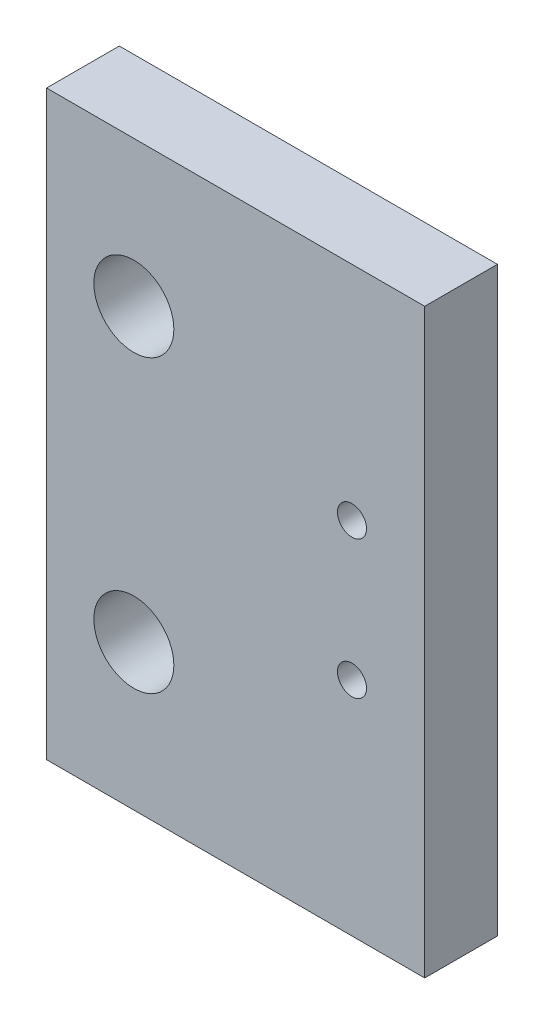
ISO-10303-21;
HEADER;
FILE_DESCRIPTION(('STEP AP214'),'2;1');
FILE_NAME('part.step','',(''),(''),'','','');
FILE_SCHEMA(('AUTOMOTIVE_DESIGN { 1 0 10303 214 1 1 1 1 }'));
ENDSEC;
DATA;
#1=APPLICATION_CONTEXT('core data for automotive mechanical design processes');
#2=APPLICATION_PROTOCOL_DEFINITION('international standard','automotive_design',2000,#1);
#3=PRODUCT_CONTEXT('',#1,'mechanical');
#4=PRODUCT('Part','Part','',(#3));
#5=PRODUCT_RELATED_PRODUCT_CATEGORY('part','',(#4));
#6=PRODUCT_DEFINITION_FORMATION('','',#4);
#7=PRODUCT_DEFINITION_CONTEXT('part definition',#1,'design');
#8=PRODUCT_DEFINITION('design','',#6,#7);
#9=PRODUCT_DEFINITION_SHAPE('','',#8);
#10=(LENGTH_UNIT() NAMED_UNIT(*) SI_UNIT(.MILLI.,.METRE.));
#11=(NAMED_UNIT(*) PLANE_ANGLE_UNIT() SI_UNIT($,.RADIAN.));
#12=(NAMED_UNIT(*) SI_UNIT($,.STERADIAN.) SOLID_ANGLE_UNIT());
#13=UNCERTAINTY_MEASURE_WITH_UNIT(LENGTH_MEASURE(1.E-05),#10,'distance_accuracy_value','');
#14=(GEOMETRIC_REPRESENTATION_CONTEXT(3) GLOBAL_UNCERTAINTY_ASSIGNED_CONTEXT((#13)) GLOBAL_UNIT_ASSIGNED_CONTEXT((#10,
#11,#12)) REPRESENTATION_CONTEXT('',''));
#15=CARTESIAN_POINT('',(0.,0.,0.));
#16=DIRECTION('',(0.,0.,1.));
#17=DIRECTION('',(1.,0.,0.));
#18=AXIS2_PLACEMENT_3D('',#15,#16,#17);
#19=CARTESIAN_POINT('',(0.,0.,5.));
#20=DIRECTION('',(0.,0.,1.));
#21=DIRECTION('',(1.,0.,0.));
#22=AXIS2_PLACEMENT_3D('',#19,#20,#21);
#23=PLANE('',#22);
#24=CARTESIAN_POINT('',(-23.6032333051564,8.12920402873281,5.));
#25=DIRECTION('',(0.,0.,1.));
#26=DIRECTION('',(1.,0.,0.));
#27=AXIS2_PLACEMENT_3D('',#24,#25,#26);
#28=CIRCLE('',#27,0.999999999999998);
#29=CARTESIAN_POINT('',(-22.6032333051564,8.12920402873281,5.));
#30=VERTEX_POINT('',#29);
#31=EDGE_CURVE('E124',#30,#30,#28,.T.);
#32=ORIENTED_EDGE('',*,*,#31,.F.);
#33=EDGE_LOOP('',(#32));
#34=FACE_BOUND('',#33,.T.);
#35=CARTESIAN_POINT('',(-38.6032333051564,13.3792040287328,5.));
#36=DIRECTION('',(0.,0.,1.));
#37=DIRECTION('',(1.,0.,0.));
#38=AXIS2_PLACEMENT_3D('',#35,#36,#37);
#39=CIRCLE('',#38,2.75);
#40=CARTESIAN_POINT('',(-35.8532333051564,13.3792040287328,5.));
#41=VERTEX_POINT('',#40);
#42=EDGE_CURVE('E103',#41,#41,#39,.T.);
#43=ORIENTED_EDGE('',*,*,#42,.F.);
#44=EDGE_LOOP('',(#43));
#45=FACE_BOUND('',#44,.T.);
#46=DIRECTION('',(0.,-1.,0.));
#47=VECTOR('',#46,1.);
#48=CARTESIAN_POINT('',(-44.6032333051564,23.3792040287328,5.));
#49=LINE('',#48,#47);
#50=CARTESIAN_POINT('',(-44.6032333051564,23.3792040287328,5.));
#51=VERTEX_POINT('',#50);
#52=CARTESIAN_POINT('',(-44.6032333051564,-16.6207959712672,5.));
#53=VERTEX_POINT('',#52);
#54=EDGE_CURVE('E88',#51,#53,#49,.T.);
#55=ORIENTED_EDGE('',*,*,#54,.T.);
#56=DIRECTION('',(1.,0.,0.));
#57=VECTOR('',#56,1.);
#58=CARTESIAN_POINT('',(-44.6032333051564,-16.6207959712672,5.));
#59=LINE('',#58,#57);
#60=CARTESIAN_POINT('',(-18.6032333051564,-16.6207959712672,5.));
#61=VERTEX_POINT('',#60);
#62=EDGE_CURVE('E83',#53,#61,#59,.T.);
#63=ORIENTED_EDGE('',*,*,#62,.T.);
#64=DIRECTION('',(0.,1.,0.));
#65=VECTOR('',#64,1.);
#66=CARTESIAN_POINT('',(-18.6032333051564,23.3792040287328,5.));
#67=LINE('',#66,#65);
#68=CARTESIAN_POINT('',(-18.6032333051564,23.3792040287328,5.));
#69=VERTEX_POINT('',#68);
#70=EDGE_CURVE('E86',#61,#69,#67,.T.);
#71=ORIENTED_EDGE('',*,*,#70,.T.);
#72=DIRECTION('',(-1.,0.,0.));
#73=VECTOR('',#72,1.);
#74=CARTESIAN_POINT('',(-44.6032333051564,23.3792040287328,5.));
#75=LINE('',#74,#73);
#76=EDGE_CURVE('E53',#69,#51,#75,.T.);
#77=ORIENTED_EDGE('',*,*,#76,.T.);
#78=EDGE_LOOP('',(#55,#63,#71,#77));
#79=FACE_BOUND('',#78,.T.);
#80=CARTESIAN_POINT('',(-38.6032333051564,-6.6207959712672,5.));
#81=DIRECTION('',(0.,0.,1.));
#82=DIRECTION('',(1.,0.,0.));
#83=AXIS2_PLACEMENT_3D('',#80,#81,#82);
#84=CIRCLE('',#83,2.75);
#85=CARTESIAN_POINT('',(-35.8532333051564,-6.6207959712672,5.));
#86=VERTEX_POINT('',#85);
#87=EDGE_CURVE('E118',#86,#86,#84,.T.);
#88=ORIENTED_EDGE('',*,*,#87,.F.);
#89=EDGE_LOOP('',(#88));
#90=FACE_BOUND('',#89,.T.);
#91=CARTESIAN_POINT('',(-23.6032333051564,-1.3707959712672,5.));
#92=DIRECTION('',(0.,0.,1.));
#93=DIRECTION('',(1.,0.,0.));
#94=AXIS2_PLACEMENT_3D('',#91,#92,#93);
#95=CIRCLE('',#94,0.999999999999998);
#96=CARTESIAN_POINT('',(-22.6032333051564,-1.3707959712672,5.));
#97=VERTEX_POINT('',#96);
#98=EDGE_CURVE('E130',#97,#97,#95,.T.);
#99=ORIENTED_EDGE('',*,*,#98,.F.);
#100=EDGE_LOOP('',(#99));
#101=FACE_BOUND('',#100,.T.);
#102=ADVANCED_FACE('F36',(#34,#45,#79,#90,#101),#23,.T.);
#103=CARTESIAN_POINT('',(0.,0.,0.));
#104=DIRECTION('',(0.,0.,1.));
#105=DIRECTION('',(1.,0.,0.));
#106=AXIS2_PLACEMENT_3D('',#103,#104,#105);
#107=PLANE('',#106);
#108=DIRECTION('',(0.,-1.,0.));
#109=VECTOR('',#108,1.);
#110=CARTESIAN_POINT('',(-44.6032333051564,23.3792040287328,0.));
#111=LINE('',#110,#109);
#112=CARTESIAN_POINT('',(-44.6032333051564,23.3792040287328,0.));
#113=VERTEX_POINT('',#112);
#114=CARTESIAN_POINT('',(-44.6032333051564,-16.6207959712672,0.));
#115=VERTEX_POINT('',#114);
#116=EDGE_CURVE('E100',#113,#115,#111,.T.);
#117=ORIENTED_EDGE('',*,*,#116,.F.);
#118=DIRECTION('',(-1.,0.,0.));
#119=VECTOR('',#118,1.);
#120=CARTESIAN_POINT('',(-44.6032333051564,23.3792040287328,0.));
#121=LINE('',#120,#119);
#122=CARTESIAN_POINT('',(-18.6032333051564,23.3792040287328,0.));
#123=VERTEX_POINT('',#122);
#124=EDGE_CURVE('E76',#123,#113,#121,.T.);
#125=ORIENTED_EDGE('',*,*,#124,.F.);
#126=DIRECTION('',(0.,1.,0.));
#127=VECTOR('',#126,1.);
#128=CARTESIAN_POINT('',(-18.6032333051564,23.3792040287328,0.));
#129=LINE('',#128,#127);
#130=CARTESIAN_POINT('',(-18.6032333051564,-16.6207959712672,0.));
#131=VERTEX_POINT('',#130);
#132=EDGE_CURVE('E70',#131,#123,#129,.T.);
#133=ORIENTED_EDGE('',*,*,#132,.F.);
#134=DIRECTION('',(1.,0.,0.));
#135=VECTOR('',#134,1.);
#136=CARTESIAN_POINT('',(-44.6032333051564,-16.6207959712672,0.));
#137=LINE('',#136,#135);
#138=EDGE_CURVE('E92',#115,#131,#137,.T.);
#139=ORIENTED_EDGE('',*,*,#138,.F.);
#140=EDGE_LOOP('',(#117,#125,#133,#139));
#141=FACE_BOUND('',#140,.T.);
#142=CARTESIAN_POINT('',(-38.6032333051564,13.3792040287328,0.));
#143=DIRECTION('',(0.,0.,1.));
#144=DIRECTION('',(1.,0.,0.));
#145=AXIS2_PLACEMENT_3D('',#142,#143,#144);
#146=CIRCLE('',#145,2.75);
#147=CARTESIAN_POINT('',(-35.8532333051564,13.3792040287328,0.));
#148=VERTEX_POINT('',#147);
#149=EDGE_CURVE('E115',#148,#148,#146,.T.);
#150=ORIENTED_EDGE('',*,*,#149,.T.);
#151=EDGE_LOOP('',(#150));
#152=FACE_BOUND('',#151,.T.);
#153=CARTESIAN_POINT('',(-38.6032333051564,-6.6207959712672,0.));
#154=DIRECTION('',(0.,0.,1.));
#155=DIRECTION('',(1.,0.,0.));
#156=AXIS2_PLACEMENT_3D('',#153,#154,#155);
#157=CIRCLE('',#156,2.75);
#158=CARTESIAN_POINT('',(-35.8532333051564,-6.6207959712672,0.));
#159=VERTEX_POINT('',#158);
#160=EDGE_CURVE('E121',#159,#159,#157,.T.);
#161=ORIENTED_EDGE('',*,*,#160,.T.);
#162=EDGE_LOOP('',(#161));
#163=FACE_BOUND('',#162,.T.);
#164=CARTESIAN_POINT('',(-23.6032333051564,8.12920402873281,0.));
#165=DIRECTION('',(0.,0.,1.));
#166=DIRECTION('',(1.,0.,0.));
#167=AXIS2_PLACEMENT_3D('',#164,#165,#166);
#168=CIRCLE('',#167,0.999999999999998);
#169=CARTESIAN_POINT('',(-22.6032333051564,8.12920402873281,0.));
#170=VERTEX_POINT('',#169);
#171=EDGE_CURVE('E127',#170,#170,#168,.T.);
#172=ORIENTED_EDGE('',*,*,#171,.T.);
#173=EDGE_LOOP('',(#172));
#174=FACE_BOUND('',#173,.T.);
#175=CARTESIAN_POINT('',(-23.6032333051564,-1.3707959712672,0.));
#176=DIRECTION('',(0.,0.,1.));
#177=DIRECTION('',(1.,0.,0.));
#178=AXIS2_PLACEMENT_3D('',#175,#176,#177);
#179=CIRCLE('',#178,0.999999999999998);
#180=CARTESIAN_POINT('',(-22.6032333051564,-1.3707959712672,0.));
#181=VERTEX_POINT('',#180);
#182=EDGE_CURVE('E133',#181,#181,#179,.T.);
#183=ORIENTED_EDGE('',*,*,#182,.T.);
#184=EDGE_LOOP('',(#183));
#185=FACE_BOUND('',#184,.T.);
#186=ADVANCED_FACE('F111',(#141,#152,#163,#174,#185),#107,.F.);
#187=CARTESIAN_POINT('',(-44.6032333051564,23.3792040287328,5.));
#188=DIRECTION('',(1.,0.,0.));
#189=DIRECTION('',(0.,0.,-1.));
#190=AXIS2_PLACEMENT_3D('',#187,#188,#189);
#191=PLANE('',#190);
#192=ORIENTED_EDGE('',*,*,#116,.T.);
#193=DIRECTION('',(0.,0.,-1.));
#194=VECTOR('',#193,1.);
#195=CARTESIAN_POINT('',(-44.6032333051564,-16.6207959712672,5.));
#196=LINE('',#195,#194);
#197=EDGE_CURVE('E11',#53,#115,#196,.T.);
#198=ORIENTED_EDGE('',*,*,#197,.F.);
#199=ORIENTED_EDGE('',*,*,#54,.F.);
#200=DIRECTION('',(0.,0.,-1.));
#201=VECTOR('',#200,1.);
#202=CARTESIAN_POINT('',(-44.6032333051564,23.3792040287328,5.));
#203=LINE('',#202,#201);
#204=EDGE_CURVE('E96',#51,#113,#203,.T.);
#205=ORIENTED_EDGE('',*,*,#204,.T.);
#206=EDGE_LOOP('',(#192,#198,#199,#205));
#207=FACE_BOUND('',#206,.T.);
#208=ADVANCED_FACE('F38',(#207),#191,.F.);
#209=CARTESIAN_POINT('',(-44.6032333051564,-16.6207959712672,5.));
#210=DIRECTION('',(0.,1.,0.));
#211=DIRECTION('',(0.,0.,1.));
#212=AXIS2_PLACEMENT_3D('',#209,#210,#211);
#213=PLANE('',#212);
#214=ORIENTED_EDGE('',*,*,#138,.T.);
#215=DIRECTION('',(0.,0.,-1.));
#216=VECTOR('',#215,1.);
#217=CARTESIAN_POINT('',(-18.6032333051564,-16.6207959712672,5.));
#218=LINE('',#217,#216);
#219=EDGE_CURVE('E45',#61,#131,#218,.T.);
#220=ORIENTED_EDGE('',*,*,#219,.F.);
#221=ORIENTED_EDGE('',*,*,#62,.F.);
#222=ORIENTED_EDGE('',*,*,#197,.T.);
#223=EDGE_LOOP('',(#214,#220,#221,#222));
#224=FACE_BOUND('',#223,.T.);
#225=ADVANCED_FACE('F91',(#224),#213,.F.);
#226=CARTESIAN_POINT('',(-18.6032333051564,23.3792040287328,5.));
#227=DIRECTION('',(-1.,0.,0.));
#228=DIRECTION('',(0.,0.,1.));
#229=AXIS2_PLACEMENT_3D('',#226,#227,#228);
#230=PLANE('',#229);
#231=ORIENTED_EDGE('',*,*,#132,.T.);
#232=DIRECTION('',(0.,0.,-1.));
#233=VECTOR('',#232,1.);
#234=CARTESIAN_POINT('',(-18.6032333051564,23.3792040287328,5.));
#235=LINE('',#234,#233);
#236=EDGE_CURVE('E93',#69,#123,#235,.T.);
#237=ORIENTED_EDGE('',*,*,#236,.F.);
#238=ORIENTED_EDGE('',*,*,#70,.F.);
#239=ORIENTED_EDGE('',*,*,#219,.T.);
#240=EDGE_LOOP('',(#231,#237,#238,#239));
#241=FACE_BOUND('',#240,.T.);
#242=ADVANCED_FACE('F94',(#241),#230,.F.);
#243=CARTESIAN_POINT('',(-44.6032333051564,23.3792040287328,5.));
#244=DIRECTION('',(0.,-1.,0.));
#245=DIRECTION('',(0.,0.,-1.));
#246=AXIS2_PLACEMENT_3D('',#243,#244,#245);
#247=PLANE('',#246);
#248=ORIENTED_EDGE('',*,*,#124,.T.);
#249=ORIENTED_EDGE('',*,*,#204,.F.);
#250=ORIENTED_EDGE('',*,*,#76,.F.);
#251=ORIENTED_EDGE('',*,*,#236,.T.);
#252=EDGE_LOOP('',(#248,#249,#250,#251));
#253=FACE_BOUND('',#252,.T.);
#254=ADVANCED_FACE('F108',(#253),#247,.F.);
#255=CARTESIAN_POINT('',(-38.6032333051564,13.3792040287328,5.));
#256=DIRECTION('',(0.,0.,-1.));
#257=DIRECTION('',(-1.,0.,0.));
#258=AXIS2_PLACEMENT_3D('',#255,#256,#257);
#259=CYLINDRICAL_SURFACE('',#258,2.75);
#260=ORIENTED_EDGE('',*,*,#42,.T.);
#261=EDGE_LOOP('',(#260));
#262=FACE_BOUND('',#261,.T.);
#263=ORIENTED_EDGE('',*,*,#149,.F.);
#264=EDGE_LOOP('',(#263));
#265=FACE_BOUND('',#264,.T.);
#266=ADVANCED_FACE('F152',(#262,#265),#259,.F.);
#267=CARTESIAN_POINT('',(-38.6032333051564,-6.6207959712672,5.));
#268=DIRECTION('',(0.,0.,-1.));
#269=DIRECTION('',(-1.,0.,0.));
#270=AXIS2_PLACEMENT_3D('',#267,#268,#269);
#271=CYLINDRICAL_SURFACE('',#270,2.75);
#272=ORIENTED_EDGE('',*,*,#87,.T.);
#273=EDGE_LOOP('',(#272));
#274=FACE_BOUND('',#273,.T.);
#275=ORIENTED_EDGE('',*,*,#160,.F.);
#276=EDGE_LOOP('',(#275));
#277=FACE_BOUND('',#276,.T.);
#278=ADVANCED_FACE('F198',(#274,#277),#271,.F.);
#279=CARTESIAN_POINT('',(-23.6032333051564,8.12920402873281,5.));
#280=DIRECTION('',(0.,0.,-1.));
#281=DIRECTION('',(-1.,0.,0.));
#282=AXIS2_PLACEMENT_3D('',#279,#280,#281);
#283=CYLINDRICAL_SURFACE('',#282,0.999999999999998);
#284=ORIENTED_EDGE('',*,*,#31,.T.);
#285=EDGE_LOOP('',(#284));
#286=FACE_BOUND('',#285,.T.);
#287=ORIENTED_EDGE('',*,*,#171,.F.);
#288=EDGE_LOOP('',(#287));
#289=FACE_BOUND('',#288,.T.);
#290=ADVANCED_FACE('F206',(#286,#289),#283,.F.);
#291=CARTESIAN_POINT('',(-23.6032333051564,-1.3707959712672,5.));
#292=DIRECTION('',(0.,0.,-1.));
#293=DIRECTION('',(-1.,0.,0.));
#294=AXIS2_PLACEMENT_3D('',#291,#292,#293);
#295=CYLINDRICAL_SURFACE('',#294,0.999999999999998);
#296=ORIENTED_EDGE('',*,*,#98,.T.);
#297=EDGE_LOOP('',(#296));
#298=FACE_BOUND('',#297,.T.);
#299=ORIENTED_EDGE('',*,*,#182,.F.);
#300=EDGE_LOOP('',(#299));
#301=FACE_BOUND('',#300,.T.);
#302=ADVANCED_FACE('F139',(#298,#301),#295,.F.);
#303=CLOSED_SHELL('',(#102,#186,#208,#225,#242,#254,#266,#278,#290,#302));
#304=MANIFOLD_SOLID_BREP('B2',#303);
#305=ADVANCED_BREP_SHAPE_REPRESENTATION('',(#18,#304),#14);
#306=SHAPE_DEFINITION_REPRESENTATION(#9,#305);
ENDSEC;
END-ISO-10303-21;
